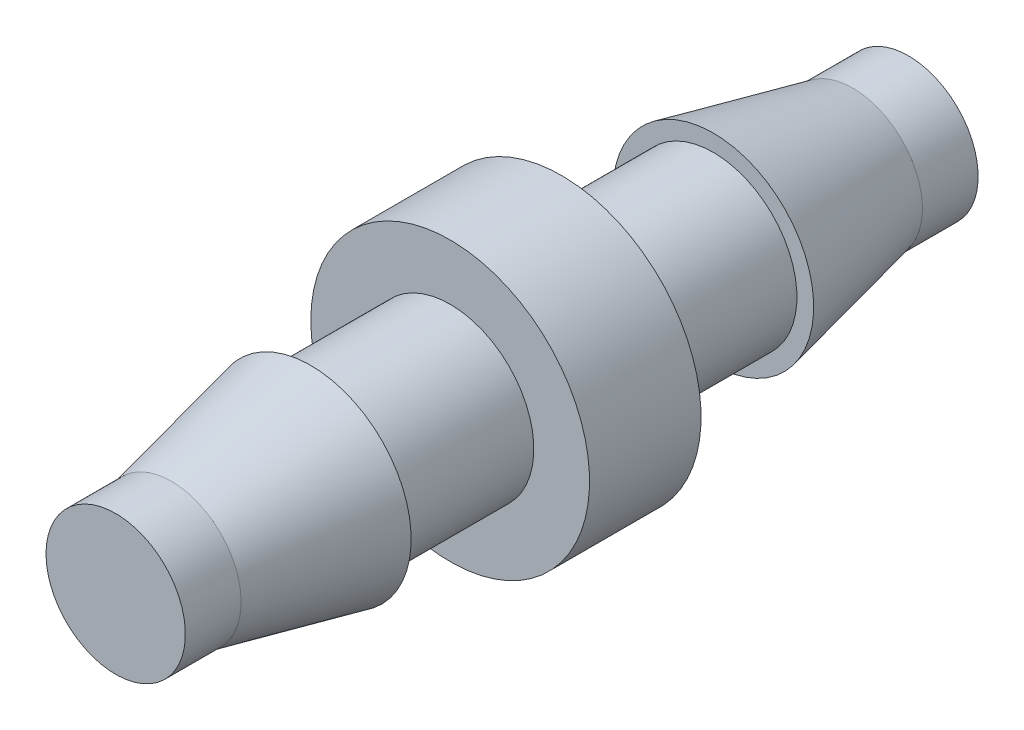
ISO-10303-21;
HEADER;
FILE_DESCRIPTION(('STEP AP214'),'2;1');
FILE_NAME('part.step','',(''),(''),'','','');
FILE_SCHEMA(('AUTOMOTIVE_DESIGN { 1 0 10303 214 1 1 1 1 }'));
ENDSEC;
DATA;
#1=APPLICATION_CONTEXT('core data for automotive mechanical design processes');
#2=APPLICATION_PROTOCOL_DEFINITION('international standard','automotive_design',2000,#1);
#3=PRODUCT_CONTEXT('',#1,'mechanical');
#4=PRODUCT('Part','Part','',(#3));
#5=PRODUCT_RELATED_PRODUCT_CATEGORY('part','',(#4));
#6=PRODUCT_DEFINITION_FORMATION('','',#4);
#7=PRODUCT_DEFINITION_CONTEXT('part definition',#1,'design');
#8=PRODUCT_DEFINITION('design','',#6,#7);
#9=PRODUCT_DEFINITION_SHAPE('','',#8);
#10=(LENGTH_UNIT() NAMED_UNIT(*) SI_UNIT(.MILLI.,.METRE.));
#11=(NAMED_UNIT(*) PLANE_ANGLE_UNIT() SI_UNIT($,.RADIAN.));
#12=(NAMED_UNIT(*) SI_UNIT($,.STERADIAN.) SOLID_ANGLE_UNIT());
#13=UNCERTAINTY_MEASURE_WITH_UNIT(LENGTH_MEASURE(1.E-05),#10,'distance_accuracy_value','');
#14=(GEOMETRIC_REPRESENTATION_CONTEXT(3) GLOBAL_UNCERTAINTY_ASSIGNED_CONTEXT((#13)) GLOBAL_UNIT_ASSIGNED_CONTEXT((#10,
#11,#12)) REPRESENTATION_CONTEXT('',''));
#15=CARTESIAN_POINT('',(0.,0.,0.));
#16=DIRECTION('',(0.,0.,1.));
#17=DIRECTION('',(1.,0.,0.));
#18=AXIS2_PLACEMENT_3D('',#15,#16,#17);
#19=CARTESIAN_POINT('',(0.,0.,0.));
#20=DIRECTION('',(0.,0.,1.));
#21=DIRECTION('',(1.,0.,0.));
#22=AXIS2_PLACEMENT_3D('',#19,#20,#21);
#23=PLANE('',#22);
#24=CARTESIAN_POINT('',(0.,0.,0.));
#25=DIRECTION('',(0.,0.,-1.));
#26=DIRECTION('',(-1.,0.,0.));
#27=AXIS2_PLACEMENT_3D('',#24,#25,#26);
#28=CIRCLE('',#27,3.175);
#29=CARTESIAN_POINT('',(-3.175,0.,0.));
#30=VERTEX_POINT('',#29);
#31=EDGE_CURVE('E10',#30,#30,#28,.T.);
#32=ORIENTED_EDGE('',*,*,#31,.F.);
#33=EDGE_LOOP('',(#32));
#34=FACE_BOUND('',#33,.T.);
#35=ADVANCED_FACE('F31',(#34),#23,.T.);
#36=CARTESIAN_POINT('',(0.,0.,-36.1188));
#37=DIRECTION('',(0.,0.,-1.));
#38=DIRECTION('',(-1.,0.,0.));
#39=AXIS2_PLACEMENT_3D('',#36,#37,#38);
#40=CYLINDRICAL_SURFACE('',#39,3.175);
#41=ORIENTED_EDGE('',*,*,#31,.T.);
#42=EDGE_LOOP('',(#41));
#43=FACE_BOUND('',#42,.T.);
#44=CARTESIAN_POINT('',(0.,0.,-2.54));
#45=DIRECTION('',(0.,0.,-1.));
#46=DIRECTION('',(-1.,0.,0.));
#47=AXIS2_PLACEMENT_3D('',#44,#45,#46);
#48=CIRCLE('',#47,3.175);
#49=CARTESIAN_POINT('',(-3.175,0.,-2.54));
#50=VERTEX_POINT('',#49);
#51=EDGE_CURVE('E37',#50,#50,#48,.T.);
#52=ORIENTED_EDGE('',*,*,#51,.F.);
#53=EDGE_LOOP('',(#52));
#54=FACE_BOUND('',#53,.T.);
#55=ADVANCED_FACE('F91',(#43,#54),#40,.T.);
#56=CARTESIAN_POINT('',(0.,0.,-8.89));
#57=DIRECTION('',(0.,0.,-1.));
#58=DIRECTION('',(-1.,0.,0.));
#59=AXIS2_PLACEMENT_3D('',#56,#57,#58);
#60=CONICAL_SURFACE('',#59,4.572,0.216550304976089);
#61=ORIENTED_EDGE('',*,*,#51,.T.);
#62=EDGE_LOOP('',(#61));
#63=FACE_BOUND('',#62,.T.);
#64=CARTESIAN_POINT('',(0.,0.,-8.89));
#65=DIRECTION('',(0.,0.,-1.));
#66=DIRECTION('',(-1.,0.,0.));
#67=AXIS2_PLACEMENT_3D('',#64,#65,#66);
#68=CIRCLE('',#67,4.572);
#69=CARTESIAN_POINT('',(-4.572,0.,-8.89));
#70=VERTEX_POINT('',#69);
#71=EDGE_CURVE('E41',#70,#70,#68,.T.);
#72=ORIENTED_EDGE('',*,*,#71,.F.);
#73=EDGE_LOOP('',(#72));
#74=FACE_BOUND('',#73,.T.);
#75=ADVANCED_FACE('F96',(#63,#74),#60,.T.);
#76=CARTESIAN_POINT('',(0.,4.572,-8.89));
#77=DIRECTION('',(0.,0.,-1.));
#78=DIRECTION('',(-1.,0.,0.));
#79=AXIS2_PLACEMENT_3D('',#76,#77,#78);
#80=PLANE('',#79);
#81=ORIENTED_EDGE('',*,*,#71,.T.);
#82=EDGE_LOOP('',(#81));
#83=FACE_BOUND('',#82,.T.);
#84=CARTESIAN_POINT('',(0.,0.,-8.89));
#85=DIRECTION('',(0.,0.,-1.));
#86=DIRECTION('',(-1.,0.,0.));
#87=AXIS2_PLACEMENT_3D('',#84,#85,#86);
#88=CIRCLE('',#87,3.80999999999999);
#89=CARTESIAN_POINT('',(-3.80999999999999,0.,-8.89));
#90=VERTEX_POINT('',#89);
#91=EDGE_CURVE('E45',#90,#90,#88,.T.);
#92=ORIENTED_EDGE('',*,*,#91,.F.);
#93=EDGE_LOOP('',(#92));
#94=FACE_BOUND('',#93,.T.);
#95=ADVANCED_FACE('F100',(#83,#94),#80,.T.);
#96=CARTESIAN_POINT('',(0.,0.,-36.1188));
#97=DIRECTION('',(0.,0.,-1.));
#98=DIRECTION('',(-1.,0.,0.));
#99=AXIS2_PLACEMENT_3D('',#96,#97,#98);
#100=CYLINDRICAL_SURFACE('',#99,3.80999999999999);
#101=ORIENTED_EDGE('',*,*,#91,.T.);
#102=EDGE_LOOP('',(#101));
#103=FACE_BOUND('',#102,.T.);
#104=CARTESIAN_POINT('',(0.,0.,-15.24));
#105=DIRECTION('',(0.,0.,-1.));
#106=DIRECTION('',(-1.,0.,0.));
#107=AXIS2_PLACEMENT_3D('',#104,#105,#106);
#108=CIRCLE('',#107,3.81);
#109=CARTESIAN_POINT('',(-3.81,0.,-15.24));
#110=VERTEX_POINT('',#109);
#111=EDGE_CURVE('E50',#110,#110,#108,.T.);
#112=ORIENTED_EDGE('',*,*,#111,.F.);
#113=EDGE_LOOP('',(#112));
#114=FACE_BOUND('',#113,.T.);
#115=ADVANCED_FACE('F106',(#103,#114),#100,.T.);
#116=CARTESIAN_POINT('',(0.,3.81,-15.24));
#117=DIRECTION('',(0.,0.,1.));
#118=DIRECTION('',(1.,0.,0.));
#119=AXIS2_PLACEMENT_3D('',#116,#117,#118);
#120=PLANE('',#119);
#121=ORIENTED_EDGE('',*,*,#111,.T.);
#122=EDGE_LOOP('',(#121));
#123=FACE_BOUND('',#122,.T.);
#124=CARTESIAN_POINT('',(0.,0.,-15.24));
#125=DIRECTION('',(0.,0.,-1.));
#126=DIRECTION('',(-1.,0.,0.));
#127=AXIS2_PLACEMENT_3D('',#124,#125,#126);
#128=CIRCLE('',#127,6.35);
#129=CARTESIAN_POINT('',(-6.35,0.,-15.24));
#130=VERTEX_POINT('',#129);
#131=EDGE_CURVE('E53',#130,#130,#128,.T.);
#132=ORIENTED_EDGE('',*,*,#131,.F.);
#133=EDGE_LOOP('',(#132));
#134=FACE_BOUND('',#133,.T.);
#135=ADVANCED_FACE('F110',(#123,#134),#120,.T.);
#136=CARTESIAN_POINT('',(0.,0.,-36.1188));
#137=DIRECTION('',(0.,0.,-1.));
#138=DIRECTION('',(-1.,0.,0.));
#139=AXIS2_PLACEMENT_3D('',#136,#137,#138);
#140=CYLINDRICAL_SURFACE('',#139,6.35);
#141=ORIENTED_EDGE('',*,*,#131,.T.);
#142=EDGE_LOOP('',(#141));
#143=FACE_BOUND('',#142,.T.);
#144=CARTESIAN_POINT('',(0.,0.,-20.32));
#145=DIRECTION('',(0.,0.,-1.));
#146=DIRECTION('',(-1.,0.,0.));
#147=AXIS2_PLACEMENT_3D('',#144,#145,#146);
#148=CIRCLE('',#147,6.35);
#149=CARTESIAN_POINT('',(-6.35,0.,-20.32));
#150=VERTEX_POINT('',#149);
#151=EDGE_CURVE('E56',#150,#150,#148,.T.);
#152=ORIENTED_EDGE('',*,*,#151,.F.);
#153=EDGE_LOOP('',(#152));
#154=FACE_BOUND('',#153,.T.);
#155=ADVANCED_FACE('F114',(#143,#154),#140,.T.);
#156=CARTESIAN_POINT('',(0.,0.,-20.8788));
#157=DIRECTION('',(0.,0.,1.));
#158=DIRECTION('',(1.,0.,0.));
#159=AXIS2_PLACEMENT_3D('',#156,#157,#158);
#160=CONICAL_SURFACE('',#159,3.81,1.35424602181881);
#161=ORIENTED_EDGE('',*,*,#151,.T.);
#162=EDGE_LOOP('',(#161));
#163=FACE_BOUND('',#162,.T.);
#164=CARTESIAN_POINT('',(0.,0.,-20.8788));
#165=DIRECTION('',(0.,0.,-1.));
#166=DIRECTION('',(-1.,0.,0.));
#167=AXIS2_PLACEMENT_3D('',#164,#165,#166);
#168=CIRCLE('',#167,3.81);
#169=CARTESIAN_POINT('',(-3.81,0.,-20.8788));
#170=VERTEX_POINT('',#169);
#171=EDGE_CURVE('E59',#170,#170,#168,.T.);
#172=ORIENTED_EDGE('',*,*,#171,.F.);
#173=EDGE_LOOP('',(#172));
#174=FACE_BOUND('',#173,.T.);
#175=ADVANCED_FACE('F118',(#163,#174),#160,.T.);
#176=CARTESIAN_POINT('',(0.,0.,-36.1188));
#177=DIRECTION('',(0.,0.,-1.));
#178=DIRECTION('',(-1.,0.,0.));
#179=AXIS2_PLACEMENT_3D('',#176,#177,#178);
#180=CYLINDRICAL_SURFACE('',#179,3.81);
#181=ORIENTED_EDGE('',*,*,#171,.T.);
#182=EDGE_LOOP('',(#181));
#183=FACE_BOUND('',#182,.T.);
#184=CARTESIAN_POINT('',(0.,0.,-27.2288));
#185=DIRECTION('',(0.,0.,-1.));
#186=DIRECTION('',(-1.,0.,0.));
#187=AXIS2_PLACEMENT_3D('',#184,#185,#186);
#188=CIRCLE('',#187,3.81);
#189=CARTESIAN_POINT('',(-3.81,0.,-27.2288));
#190=VERTEX_POINT('',#189);
#191=EDGE_CURVE('E62',#190,#190,#188,.T.);
#192=ORIENTED_EDGE('',*,*,#191,.F.);
#193=EDGE_LOOP('',(#192));
#194=FACE_BOUND('',#193,.T.);
#195=ADVANCED_FACE('F122',(#183,#194),#180,.T.);
#196=CARTESIAN_POINT('',(0.,3.81,-27.2288));
#197=DIRECTION('',(0.,0.,1.));
#198=DIRECTION('',(1.,0.,0.));
#199=AXIS2_PLACEMENT_3D('',#196,#197,#198);
#200=PLANE('',#199);
#201=ORIENTED_EDGE('',*,*,#191,.T.);
#202=EDGE_LOOP('',(#201));
#203=FACE_BOUND('',#202,.T.);
#204=CARTESIAN_POINT('',(0.,0.,-27.2288));
#205=DIRECTION('',(0.,0.,-1.));
#206=DIRECTION('',(-1.,0.,0.));
#207=AXIS2_PLACEMENT_3D('',#204,#205,#206);
#208=CIRCLE('',#207,4.572);
#209=CARTESIAN_POINT('',(-4.572,0.,-27.2288));
#210=VERTEX_POINT('',#209);
#211=EDGE_CURVE('E65',#210,#210,#208,.T.);
#212=ORIENTED_EDGE('',*,*,#211,.F.);
#213=EDGE_LOOP('',(#212));
#214=FACE_BOUND('',#213,.T.);
#215=ADVANCED_FACE('F87',(#203,#214),#200,.T.);
#216=CARTESIAN_POINT('',(0.,0.,-33.5788));
#217=DIRECTION('',(0.,0.,1.));
#218=DIRECTION('',(1.,0.,0.));
#219=AXIS2_PLACEMENT_3D('',#216,#217,#218);
#220=CONICAL_SURFACE('',#219,3.175,0.216550304976089);
#221=ORIENTED_EDGE('',*,*,#211,.T.);
#222=EDGE_LOOP('',(#221));
#223=FACE_BOUND('',#222,.T.);
#224=CARTESIAN_POINT('',(0.,0.,-33.5788));
#225=DIRECTION('',(0.,0.,-1.));
#226=DIRECTION('',(-1.,0.,0.));
#227=AXIS2_PLACEMENT_3D('',#224,#225,#226);
#228=CIRCLE('',#227,3.175);
#229=CARTESIAN_POINT('',(-3.175,0.,-33.5788));
#230=VERTEX_POINT('',#229);
#231=EDGE_CURVE('E68',#230,#230,#228,.T.);
#232=ORIENTED_EDGE('',*,*,#231,.F.);
#233=EDGE_LOOP('',(#232));
#234=FACE_BOUND('',#233,.T.);
#235=ADVANCED_FACE('F79',(#223,#234),#220,.T.);
#236=CARTESIAN_POINT('',(0.,0.,-36.1188));
#237=DIRECTION('',(0.,0.,-1.));
#238=DIRECTION('',(-1.,0.,0.));
#239=AXIS2_PLACEMENT_3D('',#236,#237,#238);
#240=CYLINDRICAL_SURFACE('',#239,3.175);
#241=ORIENTED_EDGE('',*,*,#231,.T.);
#242=EDGE_LOOP('',(#241));
#243=FACE_BOUND('',#242,.T.);
#244=CARTESIAN_POINT('',(0.,0.,-36.1188));
#245=DIRECTION('',(0.,0.,-1.));
#246=DIRECTION('',(-1.,0.,0.));
#247=AXIS2_PLACEMENT_3D('',#244,#245,#246);
#248=CIRCLE('',#247,3.175);
#249=CARTESIAN_POINT('',(-3.175,0.,-36.1188));
#250=VERTEX_POINT('',#249);
#251=EDGE_CURVE('E71',#250,#250,#248,.T.);
#252=ORIENTED_EDGE('',*,*,#251,.F.);
#253=EDGE_LOOP('',(#252));
#254=FACE_BOUND('',#253,.T.);
#255=ADVANCED_FACE('F77',(#243,#254),#240,.T.);
#256=CARTESIAN_POINT('',(0.,3.175,-36.1188));
#257=DIRECTION('',(0.,0.,-1.));
#258=DIRECTION('',(-1.,0.,0.));
#259=AXIS2_PLACEMENT_3D('',#256,#257,#258);
#260=PLANE('',#259);
#261=ORIENTED_EDGE('',*,*,#251,.T.);
#262=EDGE_LOOP('',(#261));
#263=FACE_BOUND('',#262,.T.);
#264=ADVANCED_FACE('F75',(#263),#260,.T.);
#265=CLOSED_SHELL('',(#35,#55,#75,#95,#115,#135,#155,#175,#195,#215,#235,#255,#264));
#266=MANIFOLD_SOLID_BREP('B2',#265);
#267=ADVANCED_BREP_SHAPE_REPRESENTATION('',(#18,#266),#14);
#268=SHAPE_DEFINITION_REPRESENTATION(#9,#267);
ENDSEC;
END-ISO-10303-21;
